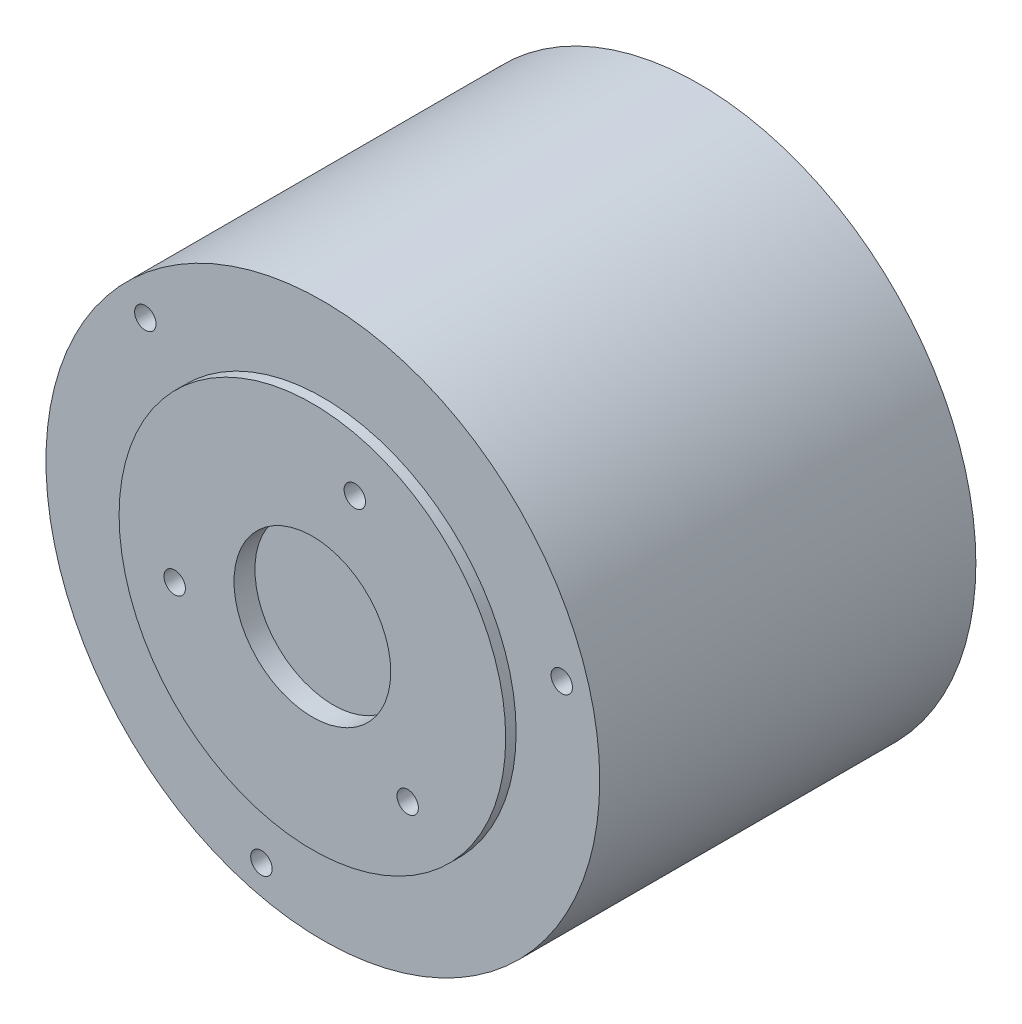
ISO-10303-21;
HEADER;
FILE_DESCRIPTION(('STEP AP214'),'2;1');
FILE_NAME('part.step','',(''),(''),'','','');
FILE_SCHEMA(('AUTOMOTIVE_DESIGN { 1 0 10303 214 1 1 1 1 }'));
ENDSEC;
DATA;
#1=APPLICATION_CONTEXT('core data for automotive mechanical design processes');
#2=APPLICATION_PROTOCOL_DEFINITION('international standard','automotive_design',2000,#1);
#3=PRODUCT_CONTEXT('',#1,'mechanical');
#4=PRODUCT('Part','Part','',(#3));
#5=PRODUCT_RELATED_PRODUCT_CATEGORY('part','',(#4));
#6=PRODUCT_DEFINITION_FORMATION('','',#4);
#7=PRODUCT_DEFINITION_CONTEXT('part definition',#1,'design');
#8=PRODUCT_DEFINITION('design','',#6,#7);
#9=PRODUCT_DEFINITION_SHAPE('','',#8);
#10=(LENGTH_UNIT() NAMED_UNIT(*) SI_UNIT(.MILLI.,.METRE.));
#11=(NAMED_UNIT(*) PLANE_ANGLE_UNIT() SI_UNIT($,.RADIAN.));
#12=(NAMED_UNIT(*) SI_UNIT($,.STERADIAN.) SOLID_ANGLE_UNIT());
#13=UNCERTAINTY_MEASURE_WITH_UNIT(LENGTH_MEASURE(1.E-05),#10,'distance_accuracy_value','');
#14=(GEOMETRIC_REPRESENTATION_CONTEXT(3) GLOBAL_UNCERTAINTY_ASSIGNED_CONTEXT((#13)) GLOBAL_UNIT_ASSIGNED_CONTEXT((#10,
#11,#12)) REPRESENTATION_CONTEXT('',''));
#15=CARTESIAN_POINT('',(0.,0.,0.));
#16=DIRECTION('',(0.,0.,1.));
#17=DIRECTION('',(1.,0.,0.));
#18=AXIS2_PLACEMENT_3D('',#15,#16,#17);
#19=CARTESIAN_POINT('',(0.,0.,-37.));
#20=DIRECTION('',(0.,0.,1.));
#21=DIRECTION('',(1.,0.,0.));
#22=AXIS2_PLACEMENT_3D('',#19,#20,#21);
#23=PLANE('',#22);
#24=CARTESIAN_POINT('',(-19.4855715851498,11.2499999999999,-37.0000000000001));
#25=DIRECTION('',(0.,0.,-1.));
#26=DIRECTION('',(0.,1.,0.));
#27=AXIS2_PLACEMENT_3D('',#24,#25,#26);
#28=CIRCLE('',#27,1.02499999999999);
#29=CARTESIAN_POINT('',(-19.4855715851498,12.2749999999999,-37.0000000000001));
#30=VERTEX_POINT('',#29);
#31=EDGE_CURVE('E119',#30,#30,#28,.T.);
#32=ORIENTED_EDGE('',*,*,#31,.F.);
#33=EDGE_LOOP('',(#32));
#34=FACE_BOUND('',#33,.T.);
#35=CARTESIAN_POINT('',(19.4855715851504,-11.2500000000002,-36.9999999999996));
#36=DIRECTION('',(0.,0.,-1.));
#37=DIRECTION('',(0.,1.,0.));
#38=AXIS2_PLACEMENT_3D('',#35,#36,#37);
#39=CIRCLE('',#38,1.02499999999999);
#40=CARTESIAN_POINT('',(19.4855715851504,-10.2250000000003,-36.9999999999996));
#41=VERTEX_POINT('',#40);
#42=EDGE_CURVE('E132',#41,#41,#39,.T.);
#43=ORIENTED_EDGE('',*,*,#42,.F.);
#44=EDGE_LOOP('',(#43));
#45=FACE_BOUND('',#44,.T.);
#46=CARTESIAN_POINT('',(19.4855715851502,11.25,-36.9999999999998));
#47=DIRECTION('',(0.,0.,-1.));
#48=DIRECTION('',(0.,1.,0.));
#49=AXIS2_PLACEMENT_3D('',#46,#47,#48);
#50=CIRCLE('',#49,1.02499999999999);
#51=CARTESIAN_POINT('',(19.4855715851502,12.275,-36.9999999999998));
#52=VERTEX_POINT('',#51);
#53=EDGE_CURVE('E140',#52,#52,#50,.T.);
#54=ORIENTED_EDGE('',*,*,#53,.F.);
#55=EDGE_LOOP('',(#54));
#56=FACE_BOUND('',#55,.T.);
#57=CARTESIAN_POINT('',(0.,22.5,-37.));
#58=DIRECTION('',(0.,0.,-1.));
#59=DIRECTION('',(-1.,0.,0.));
#60=AXIS2_PLACEMENT_3D('',#57,#58,#59);
#61=CIRCLE('',#60,1.02499999999999);
#62=CARTESIAN_POINT('',(-1.02499999999999,22.5,-37.));
#63=VERTEX_POINT('',#62);
#64=EDGE_CURVE('E180',#63,#63,#61,.T.);
#65=ORIENTED_EDGE('',*,*,#64,.F.);
#66=EDGE_LOOP('',(#65));
#67=FACE_BOUND('',#66,.T.);
#68=CARTESIAN_POINT('',(0.,0.,-37.));
#69=DIRECTION('',(0.,0.,1.));
#70=DIRECTION('',(1.,0.,0.));
#71=AXIS2_PLACEMENT_3D('',#68,#69,#70);
#72=CIRCLE('',#71,26.5);
#73=CARTESIAN_POINT('',(13.1624465810882,-23.,-37.));
#74=VERTEX_POINT('',#73);
#75=CARTESIAN_POINT('',(-13.1624465810882,-23.,-37.));
#76=VERTEX_POINT('',#75);
#77=EDGE_CURVE('E229',#74,#76,#72,.T.);
#78=ORIENTED_EDGE('',*,*,#77,.F.);
#79=DIRECTION('',(-1.,0.,0.));
#80=VECTOR('',#79,1.);
#81=CARTESIAN_POINT('',(0.,-23.,-37.));
#82=LINE('',#81,#80);
#83=EDGE_CURVE('E58',#74,#76,#82,.T.);
#84=ORIENTED_EDGE('',*,*,#83,.T.);
#85=EDGE_LOOP('',(#78,#84));
#86=FACE_BOUND('',#85,.T.);
#87=CARTESIAN_POINT('',(-19.4855715851498,-11.2500000000004,-36.9999999999999));
#88=DIRECTION('',(0.,0.,-1.));
#89=DIRECTION('',(0.,1.,0.));
#90=AXIS2_PLACEMENT_3D('',#87,#88,#89);
#91=CIRCLE('',#90,1.02499999999999);
#92=CARTESIAN_POINT('',(-19.4855715851498,-10.2250000000004,-36.9999999999999));
#93=VERTEX_POINT('',#92);
#94=EDGE_CURVE('E118',#93,#93,#91,.T.);
#95=ORIENTED_EDGE('',*,*,#94,.F.);
#96=EDGE_LOOP('',(#95));
#97=FACE_BOUND('',#96,.T.);
#98=ADVANCED_FACE('F49',(#34,#45,#56,#67,#86,#97),#23,.F.);
#99=CARTESIAN_POINT('',(0.,0.,-37.));
#100=DIRECTION('',(0.,0.,1.));
#101=DIRECTION('',(1.,0.,0.));
#102=AXIS2_PLACEMENT_3D('',#99,#100,#101);
#103=CYLINDRICAL_SURFACE('',#102,26.5);
#104=DIRECTION('',(0.,0.,1.));
#105=VECTOR('',#104,1.);
#106=CARTESIAN_POINT('',(-13.1624465810882,-23.,-37.));
#107=LINE('',#106,#105);
#108=CARTESIAN_POINT('',(-13.1624465810882,-23.,-24.5));
#109=VERTEX_POINT('',#108);
#110=EDGE_CURVE('E65',#109,#76,#107,.F.);
#111=ORIENTED_EDGE('',*,*,#110,.F.);
#112=CARTESIAN_POINT('',(0.,0.,-24.5));
#113=DIRECTION('',(0.,0.,1.));
#114=DIRECTION('',(1.,0.,0.));
#115=AXIS2_PLACEMENT_3D('',#112,#113,#114);
#116=CIRCLE('',#115,26.5);
#117=CARTESIAN_POINT('',(13.1624465810882,-23.,-24.5));
#118=VERTEX_POINT('',#117);
#119=EDGE_CURVE('E12',#118,#109,#116,.F.);
#120=ORIENTED_EDGE('',*,*,#119,.F.);
#121=DIRECTION('',(0.,0.,1.));
#122=VECTOR('',#121,1.);
#123=CARTESIAN_POINT('',(13.1624465810882,-23.,-37.));
#124=LINE('',#123,#122);
#125=EDGE_CURVE('E207',#74,#118,#124,.T.);
#126=ORIENTED_EDGE('',*,*,#125,.F.);
#127=ORIENTED_EDGE('',*,*,#77,.T.);
#128=EDGE_LOOP('',(#111,#120,#126,#127));
#129=FACE_BOUND('',#128,.T.);
#130=CARTESIAN_POINT('',(0.,0.,-1.));
#131=DIRECTION('',(0.,0.,1.));
#132=DIRECTION('',(1.,0.,0.));
#133=AXIS2_PLACEMENT_3D('',#130,#131,#132);
#134=CIRCLE('',#133,26.5);
#135=CARTESIAN_POINT('',(26.5,0.,-1.));
#136=VERTEX_POINT('',#135);
#137=EDGE_CURVE('E225',#136,#136,#134,.F.);
#138=ORIENTED_EDGE('',*,*,#137,.T.);
#139=EDGE_LOOP('',(#138));
#140=FACE_BOUND('',#139,.T.);
#141=ADVANCED_FACE('F51',(#129,#140),#103,.T.);
#142=CARTESIAN_POINT('',(0.,0.,-1.));
#143=DIRECTION('',(0.,0.,1.));
#144=DIRECTION('',(1.,0.,0.));
#145=AXIS2_PLACEMENT_3D('',#142,#143,#144);
#146=PLANE('',#145);
#147=CARTESIAN_POINT('',(22.8672908873142,6.41478818628922,-1.));
#148=DIRECTION('',(0.,0.,1.));
#149=DIRECTION('',(0.,-1.,0.));
#150=AXIS2_PLACEMENT_3D('',#147,#148,#149);
#151=CIRCLE('',#150,1.02499999999999);
#152=CARTESIAN_POINT('',(22.8672908873142,5.38978818628923,-0.999999999999987));
#153=VERTEX_POINT('',#152);
#154=EDGE_CURVE('E164',#153,#153,#151,.T.);
#155=ORIENTED_EDGE('',*,*,#154,.F.);
#156=EDGE_LOOP('',(#155));
#157=FACE_BOUND('',#156,.T.);
#158=CARTESIAN_POINT('',(-16.98901497288,16.5962607309978,-1.00000000000034));
#159=DIRECTION('',(0.,0.,1.));
#160=DIRECTION('',(0.,-1.,0.));
#161=AXIS2_PLACEMENT_3D('',#158,#159,#160);
#162=CIRCLE('',#161,1.02499999999999);
#163=CARTESIAN_POINT('',(-16.98901497288,15.5712607309978,-1.00000000000034));
#164=VERTEX_POINT('',#163);
#165=EDGE_CURVE('E172',#164,#164,#162,.T.);
#166=ORIENTED_EDGE('',*,*,#165,.F.);
#167=EDGE_LOOP('',(#166));
#168=FACE_BOUND('',#167,.T.);
#169=CARTESIAN_POINT('',(-5.87827591443412,-23.0110489172872,-0.999999999999999));
#170=DIRECTION('',(0.,0.,1.));
#171=DIRECTION('',(1.,0.,0.));
#172=AXIS2_PLACEMENT_3D('',#169,#170,#171);
#173=CIRCLE('',#172,1.02499999999999);
#174=CARTESIAN_POINT('',(-4.85327591443413,-23.0110489172872,-0.999999999999999));
#175=VERTEX_POINT('',#174);
#176=EDGE_CURVE('E196',#175,#175,#173,.T.);
#177=ORIENTED_EDGE('',*,*,#176,.F.);
#178=EDGE_LOOP('',(#177));
#179=FACE_BOUND('',#178,.T.);
#180=ORIENTED_EDGE('',*,*,#137,.F.);
#181=EDGE_LOOP('',(#180));
#182=FACE_BOUND('',#181,.T.);
#183=CARTESIAN_POINT('',(0.,0.,-1.));
#184=DIRECTION('',(0.,0.,1.));
#185=DIRECTION('',(1.,0.,0.));
#186=AXIS2_PLACEMENT_3D('',#183,#184,#185);
#187=CIRCLE('',#186,18.5);
#188=CARTESIAN_POINT('',(18.5,0.,-1.));
#189=VERTEX_POINT('',#188);
#190=EDGE_CURVE('E221',#189,#189,#187,.T.);
#191=ORIENTED_EDGE('',*,*,#190,.F.);
#192=EDGE_LOOP('',(#191));
#193=FACE_BOUND('',#192,.T.);
#194=ADVANCED_FACE('F264',(#157,#168,#179,#182,#193),#146,.T.);
#195=CARTESIAN_POINT('',(0.,0.,-1.));
#196=DIRECTION('',(0.,0.,1.));
#197=DIRECTION('',(1.,0.,0.));
#198=AXIS2_PLACEMENT_3D('',#195,#196,#197);
#199=CYLINDRICAL_SURFACE('',#198,18.5);
#200=ORIENTED_EDGE('',*,*,#190,.T.);
#201=EDGE_LOOP('',(#200));
#202=FACE_BOUND('',#201,.T.);
#203=CARTESIAN_POINT('',(0.,0.,0.));
#204=DIRECTION('',(0.,0.,1.));
#205=DIRECTION('',(1.,0.,0.));
#206=AXIS2_PLACEMENT_3D('',#203,#204,#205);
#207=CIRCLE('',#206,18.5);
#208=CARTESIAN_POINT('',(18.5,0.,0.));
#209=VERTEX_POINT('',#208);
#210=EDGE_CURVE('E217',#209,#209,#207,.T.);
#211=ORIENTED_EDGE('',*,*,#210,.F.);
#212=EDGE_LOOP('',(#211));
#213=FACE_BOUND('',#212,.T.);
#214=ADVANCED_FACE('F272',(#202,#213),#199,.T.);
#215=CARTESIAN_POINT('',(0.,0.,0.));
#216=DIRECTION('',(0.,0.,1.));
#217=DIRECTION('',(1.,0.,0.));
#218=AXIS2_PLACEMENT_3D('',#215,#216,#217);
#219=PLANE('',#218);
#220=CARTESIAN_POINT('',(-13.1799960961191,-2.92193478816436,0.));
#221=DIRECTION('',(0.,0.,1.));
#222=DIRECTION('',(0.,-1.,0.));
#223=AXIS2_PLACEMENT_3D('',#220,#221,#222);
#224=CIRCLE('',#223,1.02499999999999);
#225=CARTESIAN_POINT('',(-13.1799960961191,-3.94693478816435,0.));
#226=VERTEX_POINT('',#225);
#227=EDGE_CURVE('E148',#226,#226,#224,.T.);
#228=ORIENTED_EDGE('',*,*,#227,.F.);
#229=EDGE_LOOP('',(#228));
#230=FACE_BOUND('',#229,.T.);
#231=CARTESIAN_POINT('',(9.12046780281143,-9.95324404693666,1.89987469368766E-13));
#232=DIRECTION('',(0.,0.,1.));
#233=DIRECTION('',(0.,-1.,0.));
#234=AXIS2_PLACEMENT_3D('',#231,#232,#233);
#235=CIRCLE('',#234,1.02499999999999);
#236=CARTESIAN_POINT('',(9.12046780281143,-10.9782440469366,1.94380875931622E-13));
#237=VERTEX_POINT('',#236);
#238=EDGE_CURVE('E156',#237,#237,#235,.T.);
#239=ORIENTED_EDGE('',*,*,#238,.F.);
#240=EDGE_LOOP('',(#239));
#241=FACE_BOUND('',#240,.T.);
#242=CARTESIAN_POINT('',(4.0595282933076,12.8751788351011,0.));
#243=DIRECTION('',(0.,0.,1.));
#244=DIRECTION('',(1.,0.,0.));
#245=AXIS2_PLACEMENT_3D('',#242,#243,#244);
#246=CIRCLE('',#245,1.02499999999999);
#247=CARTESIAN_POINT('',(5.08452829330759,12.8751788351011,0.));
#248=VERTEX_POINT('',#247);
#249=EDGE_CURVE('E188',#248,#248,#246,.T.);
#250=ORIENTED_EDGE('',*,*,#249,.F.);
#251=EDGE_LOOP('',(#250));
#252=FACE_BOUND('',#251,.T.);
#253=CARTESIAN_POINT('',(0.,0.,0.));
#254=DIRECTION('',(0.,0.,1.));
#255=DIRECTION('',(1.,0.,0.));
#256=AXIS2_PLACEMENT_3D('',#253,#254,#255);
#257=CIRCLE('',#256,7.50000000000001);
#258=CARTESIAN_POINT('',(7.50000000000001,0.,0.));
#259=VERTEX_POINT('',#258);
#260=EDGE_CURVE('E212',#259,#259,#257,.T.);
#261=ORIENTED_EDGE('',*,*,#260,.F.);
#262=EDGE_LOOP('',(#261));
#263=FACE_BOUND('',#262,.T.);
#264=ORIENTED_EDGE('',*,*,#210,.T.);
#265=EDGE_LOOP('',(#264));
#266=FACE_BOUND('',#265,.T.);
#267=ADVANCED_FACE('F269',(#230,#241,#252,#263,#266),#219,.T.);
#268=CARTESIAN_POINT('',(0.,0.,-2.));
#269=DIRECTION('',(0.,0.,1.));
#270=DIRECTION('',(1.,0.,0.));
#271=AXIS2_PLACEMENT_3D('',#268,#269,#270);
#272=CYLINDRICAL_SURFACE('',#271,7.50000000000001);
#273=CARTESIAN_POINT('',(0.,0.,-2.));
#274=DIRECTION('',(0.,0.,1.));
#275=DIRECTION('',(1.,0.,0.));
#276=AXIS2_PLACEMENT_3D('',#273,#274,#275);
#277=CIRCLE('',#276,7.50000000000001);
#278=CARTESIAN_POINT('',(7.50000000000001,0.,-2.));
#279=VERTEX_POINT('',#278);
#280=EDGE_CURVE('E213',#279,#279,#277,.T.);
#281=ORIENTED_EDGE('',*,*,#280,.F.);
#282=EDGE_LOOP('',(#281));
#283=FACE_BOUND('',#282,.T.);
#284=ORIENTED_EDGE('',*,*,#260,.T.);
#285=EDGE_LOOP('',(#284));
#286=FACE_BOUND('',#285,.T.);
#287=ADVANCED_FACE('F271',(#283,#286),#272,.F.);
#288=CARTESIAN_POINT('',(0.,0.,-2.));
#289=DIRECTION('',(0.,0.,1.));
#290=DIRECTION('',(1.,0.,0.));
#291=AXIS2_PLACEMENT_3D('',#288,#289,#290);
#292=PLANE('',#291);
#293=ORIENTED_EDGE('',*,*,#280,.T.);
#294=EDGE_LOOP('',(#293));
#295=FACE_BOUND('',#294,.T.);
#296=ADVANCED_FACE('F256',(#295),#292,.T.);
#297=CARTESIAN_POINT('',(-15.,-23.,-37.));
#298=DIRECTION('',(0.,1.,0.));
#299=DIRECTION('',(0.,0.,1.));
#300=AXIS2_PLACEMENT_3D('',#297,#298,#299);
#301=PLANE('',#300);
#302=ORIENTED_EDGE('',*,*,#110,.T.);
#303=ORIENTED_EDGE('',*,*,#83,.F.);
#304=ORIENTED_EDGE('',*,*,#125,.T.);
#305=DIRECTION('',(-1.,0.,0.));
#306=VECTOR('',#305,1.);
#307=CARTESIAN_POINT('',(-15.,-23.,-24.5));
#308=LINE('',#307,#306);
#309=EDGE_CURVE('E204',#118,#109,#308,.T.);
#310=ORIENTED_EDGE('',*,*,#309,.T.);
#311=EDGE_LOOP('',(#302,#303,#304,#310));
#312=FACE_BOUND('',#311,.T.);
#313=ADVANCED_FACE('F243',(#312),#301,.F.);
#314=CARTESIAN_POINT('',(0.,0.,-24.5));
#315=DIRECTION('',(0.,0.,1.));
#316=DIRECTION('',(1.,0.,0.));
#317=AXIS2_PLACEMENT_3D('',#314,#315,#316);
#318=PLANE('',#317);
#319=ORIENTED_EDGE('',*,*,#119,.T.);
#320=ORIENTED_EDGE('',*,*,#309,.F.);
#321=EDGE_LOOP('',(#319,#320));
#322=FACE_BOUND('',#321,.T.);
#323=ADVANCED_FACE('F245',(#322),#318,.F.);
#324=CARTESIAN_POINT('',(-5.87827591443412,-23.0110489172872,-7.35));
#325=DIRECTION('',(0.,0.,1.));
#326=DIRECTION('',(1.,0.,0.));
#327=AXIS2_PLACEMENT_3D('',#324,#325,#326);
#328=CONICAL_SURFACE('',#327,1.025,1.02974425867665);
#329=CARTESIAN_POINT('',(-5.87827591443412,-23.0110489172872,-7.96588213450325));
#330=VERTEX_POINT('',#329);
#331=VERTEX_LOOP('',#330);
#332=FACE_BOUND('',#331,.T.);
#333=CARTESIAN_POINT('',(-5.87827591443412,-23.0110489172872,-7.35));
#334=DIRECTION('',(0.,0.,1.));
#335=DIRECTION('',(1.,0.,0.));
#336=AXIS2_PLACEMENT_3D('',#333,#334,#335);
#337=CIRCLE('',#336,1.025);
#338=CARTESIAN_POINT('',(-4.85327591443412,-23.0110489172872,-7.35));
#339=VERTEX_POINT('',#338);
#340=EDGE_CURVE('E200',#339,#339,#337,.T.);
#341=ORIENTED_EDGE('',*,*,#340,.T.);
#342=EDGE_LOOP('',(#341));
#343=FACE_BOUND('',#342,.T.);
#344=ADVANCED_FACE('F247',(#332,#343),#328,.F.);
#345=CARTESIAN_POINT('',(-5.87827591443412,-23.0110489172872,-1.));
#346=DIRECTION('',(0.,0.,1.));
#347=DIRECTION('',(1.,0.,0.));
#348=AXIS2_PLACEMENT_3D('',#345,#346,#347);
#349=CYLINDRICAL_SURFACE('',#348,1.02499999999999);
#350=ORIENTED_EDGE('',*,*,#340,.F.);
#351=EDGE_LOOP('',(#350));
#352=FACE_BOUND('',#351,.T.);
#353=ORIENTED_EDGE('',*,*,#176,.T.);
#354=EDGE_LOOP('',(#353));
#355=FACE_BOUND('',#354,.T.);
#356=ADVANCED_FACE('F253',(#352,#355),#349,.F.);
#357=CARTESIAN_POINT('',(4.0595282933076,12.8751788351011,-4.35));
#358=DIRECTION('',(0.,0.,1.));
#359=DIRECTION('',(1.,0.,0.));
#360=AXIS2_PLACEMENT_3D('',#357,#358,#359);
#361=CONICAL_SURFACE('',#360,1.025,1.02974425867665);
#362=CARTESIAN_POINT('',(4.0595282933076,12.8751788351011,-4.96588213450325));
#363=VERTEX_POINT('',#362);
#364=VERTEX_LOOP('',#363);
#365=FACE_BOUND('',#364,.T.);
#366=CARTESIAN_POINT('',(4.0595282933076,12.8751788351011,-4.35));
#367=DIRECTION('',(0.,0.,1.));
#368=DIRECTION('',(1.,0.,0.));
#369=AXIS2_PLACEMENT_3D('',#366,#367,#368);
#370=CIRCLE('',#369,1.025);
#371=CARTESIAN_POINT('',(5.0845282933076,12.8751788351011,-4.35));
#372=VERTEX_POINT('',#371);
#373=EDGE_CURVE('E192',#372,#372,#370,.T.);
#374=ORIENTED_EDGE('',*,*,#373,.T.);
#375=EDGE_LOOP('',(#374));
#376=FACE_BOUND('',#375,.T.);
#377=ADVANCED_FACE('F296',(#365,#376),#361,.F.);
#378=CARTESIAN_POINT('',(4.0595282933076,12.8751788351011,0.));
#379=DIRECTION('',(0.,0.,1.));
#380=DIRECTION('',(1.,0.,0.));
#381=AXIS2_PLACEMENT_3D('',#378,#379,#380);
#382=CYLINDRICAL_SURFACE('',#381,1.02499999999999);
#383=ORIENTED_EDGE('',*,*,#373,.F.);
#384=EDGE_LOOP('',(#383));
#385=FACE_BOUND('',#384,.T.);
#386=ORIENTED_EDGE('',*,*,#249,.T.);
#387=EDGE_LOOP('',(#386));
#388=FACE_BOUND('',#387,.T.);
#389=ADVANCED_FACE('F293',(#385,#388),#382,.F.);
#390=CARTESIAN_POINT('',(0.,22.5,-30.65));
#391=DIRECTION('',(0.,0.,-1.));
#392=DIRECTION('',(-1.,0.,0.));
#393=AXIS2_PLACEMENT_3D('',#390,#391,#392);
#394=CONICAL_SURFACE('',#393,1.025,1.02974425867665);
#395=CARTESIAN_POINT('',(0.,22.5,-30.0341178654967));
#396=VERTEX_POINT('',#395);
#397=VERTEX_LOOP('',#396);
#398=FACE_BOUND('',#397,.T.);
#399=CARTESIAN_POINT('',(0.,22.5,-30.65));
#400=DIRECTION('',(0.,0.,-1.));
#401=DIRECTION('',(-1.,0.,0.));
#402=AXIS2_PLACEMENT_3D('',#399,#400,#401);
#403=CIRCLE('',#402,1.025);
#404=CARTESIAN_POINT('',(-1.025,22.5,-30.65));
#405=VERTEX_POINT('',#404);
#406=EDGE_CURVE('E184',#405,#405,#403,.T.);
#407=ORIENTED_EDGE('',*,*,#406,.T.);
#408=EDGE_LOOP('',(#407));
#409=FACE_BOUND('',#408,.T.);
#410=ADVANCED_FACE('F295',(#398,#409),#394,.F.);
#411=CARTESIAN_POINT('',(0.,22.5,-37.));
#412=DIRECTION('',(0.,0.,-1.));
#413=DIRECTION('',(-1.,0.,0.));
#414=AXIS2_PLACEMENT_3D('',#411,#412,#413);
#415=CYLINDRICAL_SURFACE('',#414,1.02499999999999);
#416=ORIENTED_EDGE('',*,*,#406,.F.);
#417=EDGE_LOOP('',(#416));
#418=FACE_BOUND('',#417,.T.);
#419=ORIENTED_EDGE('',*,*,#64,.T.);
#420=EDGE_LOOP('',(#419));
#421=FACE_BOUND('',#420,.T.);
#422=ADVANCED_FACE('F303',(#418,#421),#415,.F.);
#423=CARTESIAN_POINT('',(-16.98901497288,16.5962607309978,-7.35000000000034));
#424=DIRECTION('',(0.,0.,1.));
#425=DIRECTION('',(0.,-1.,0.));
#426=AXIS2_PLACEMENT_3D('',#423,#424,#425);
#427=CONICAL_SURFACE('',#426,1.025,1.02974425867665);
#428=CARTESIAN_POINT('',(-16.98901497288,16.5962607309978,-7.96588213450359));
#429=VERTEX_POINT('',#428);
#430=VERTEX_LOOP('',#429);
#431=FACE_BOUND('',#430,.T.);
#432=CARTESIAN_POINT('',(-16.98901497288,16.5962607309978,-7.35000000000034));
#433=DIRECTION('',(0.,0.,1.));
#434=DIRECTION('',(0.,-1.,0.));
#435=AXIS2_PLACEMENT_3D('',#432,#433,#434);
#436=CIRCLE('',#435,1.025);
#437=CARTESIAN_POINT('',(-16.98901497288,15.5712607309978,-7.35000000000034));
#438=VERTEX_POINT('',#437);
#439=EDGE_CURVE('E176',#438,#438,#436,.T.);
#440=ORIENTED_EDGE('',*,*,#439,.T.);
#441=EDGE_LOOP('',(#440));
#442=FACE_BOUND('',#441,.T.);
#443=ADVANCED_FACE('F334',(#431,#442),#427,.F.);
#444=CARTESIAN_POINT('',(-16.98901497288,16.5962607309978,-1.00000000000034));
#445=DIRECTION('',(0.,0.,1.));
#446=DIRECTION('',(0.,-1.,0.));
#447=AXIS2_PLACEMENT_3D('',#444,#445,#446);
#448=CYLINDRICAL_SURFACE('',#447,1.02499999999999);
#449=ORIENTED_EDGE('',*,*,#439,.F.);
#450=EDGE_LOOP('',(#449));
#451=FACE_BOUND('',#450,.T.);
#452=ORIENTED_EDGE('',*,*,#165,.T.);
#453=EDGE_LOOP('',(#452));
#454=FACE_BOUND('',#453,.T.);
#455=ADVANCED_FACE('F331',(#451,#454),#448,.F.);
#456=CARTESIAN_POINT('',(22.8672908873142,6.41478818628911,-7.35));
#457=DIRECTION('',(0.,0.,1.));
#458=DIRECTION('',(0.,-1.,0.));
#459=AXIS2_PLACEMENT_3D('',#456,#457,#458);
#460=CONICAL_SURFACE('',#459,1.025,1.02974425867665);
#461=CARTESIAN_POINT('',(22.8672908873142,6.4147881862891,-7.96588213450325));
#462=VERTEX_POINT('',#461);
#463=VERTEX_LOOP('',#462);
#464=FACE_BOUND('',#463,.T.);
#465=CARTESIAN_POINT('',(22.8672908873142,6.41478818628911,-7.35));
#466=DIRECTION('',(0.,0.,1.));
#467=DIRECTION('',(0.,-1.,0.));
#468=AXIS2_PLACEMENT_3D('',#465,#466,#467);
#469=CIRCLE('',#468,1.025);
#470=CARTESIAN_POINT('',(22.8672908873142,5.38978818628912,-7.34999999999999));
#471=VERTEX_POINT('',#470);
#472=EDGE_CURVE('E168',#471,#471,#469,.T.);
#473=ORIENTED_EDGE('',*,*,#472,.T.);
#474=EDGE_LOOP('',(#473));
#475=FACE_BOUND('',#474,.T.);
#476=ADVANCED_FACE('F333',(#464,#475),#460,.F.);
#477=CARTESIAN_POINT('',(22.8672908873142,6.41478818628922,-1.));
#478=DIRECTION('',(0.,0.,1.));
#479=DIRECTION('',(0.,-1.,0.));
#480=AXIS2_PLACEMENT_3D('',#477,#478,#479);
#481=CYLINDRICAL_SURFACE('',#480,1.02499999999999);
#482=ORIENTED_EDGE('',*,*,#472,.F.);
#483=EDGE_LOOP('',(#482));
#484=FACE_BOUND('',#483,.T.);
#485=ORIENTED_EDGE('',*,*,#154,.T.);
#486=EDGE_LOOP('',(#485));
#487=FACE_BOUND('',#486,.T.);
#488=ADVANCED_FACE('F341',(#484,#487),#481,.F.);
#489=CARTESIAN_POINT('',(9.12046780281143,-9.95324404693667,-4.34999999999981));
#490=DIRECTION('',(0.,0.,1.));
#491=DIRECTION('',(0.,-1.,0.));
#492=AXIS2_PLACEMENT_3D('',#489,#490,#491);
#493=CONICAL_SURFACE('',#492,1.025,1.02974425867665);
#494=CARTESIAN_POINT('',(9.12046780281143,-9.95324404693668,-4.96588213450306));
#495=VERTEX_POINT('',#494);
#496=VERTEX_LOOP('',#495);
#497=FACE_BOUND('',#496,.T.);
#498=CARTESIAN_POINT('',(9.12046780281143,-9.95324404693667,-4.34999999999981));
#499=DIRECTION('',(0.,0.,1.));
#500=DIRECTION('',(0.,-1.,0.));
#501=AXIS2_PLACEMENT_3D('',#498,#499,#500);
#502=CIRCLE('',#501,1.025);
#503=CARTESIAN_POINT('',(9.12046780281143,-10.9782440469367,-4.34999999999981));
#504=VERTEX_POINT('',#503);
#505=EDGE_CURVE('E160',#504,#504,#502,.T.);
#506=ORIENTED_EDGE('',*,*,#505,.T.);
#507=EDGE_LOOP('',(#506));
#508=FACE_BOUND('',#507,.T.);
#509=ADVANCED_FACE('F396',(#497,#508),#493,.F.);
#510=CARTESIAN_POINT('',(9.12046780281143,-9.95324404693666,1.88557694230762E-13));
#511=DIRECTION('',(0.,0.,1.));
#512=DIRECTION('',(0.,-1.,0.));
#513=AXIS2_PLACEMENT_3D('',#510,#511,#512);
#514=CYLINDRICAL_SURFACE('',#513,1.02499999999999);
#515=ORIENTED_EDGE('',*,*,#505,.F.);
#516=EDGE_LOOP('',(#515));
#517=FACE_BOUND('',#516,.T.);
#518=ORIENTED_EDGE('',*,*,#238,.T.);
#519=EDGE_LOOP('',(#518));
#520=FACE_BOUND('',#519,.T.);
#521=ADVANCED_FACE('F418',(#517,#520),#514,.F.);
#522=CARTESIAN_POINT('',(-13.1799960961191,-2.92193478816443,-4.35000000000001));
#523=DIRECTION('',(0.,0.,1.));
#524=DIRECTION('',(0.,-1.,0.));
#525=AXIS2_PLACEMENT_3D('',#522,#523,#524);
#526=CONICAL_SURFACE('',#525,1.025,1.02974425867665);
#527=CARTESIAN_POINT('',(-13.1799960961191,-2.92193478816443,-4.96588213450326));
#528=VERTEX_POINT('',#527);
#529=VERTEX_LOOP('',#528);
#530=FACE_BOUND('',#529,.T.);
#531=CARTESIAN_POINT('',(-13.1799960961191,-2.92193478816443,-4.35000000000001));
#532=DIRECTION('',(0.,0.,1.));
#533=DIRECTION('',(0.,-1.,0.));
#534=AXIS2_PLACEMENT_3D('',#531,#532,#533);
#535=CIRCLE('',#534,1.025);
#536=CARTESIAN_POINT('',(-13.1799960961191,-3.94693478816442,-4.34999999999999));
#537=VERTEX_POINT('',#536);
#538=EDGE_CURVE('E152',#537,#537,#535,.T.);
#539=ORIENTED_EDGE('',*,*,#538,.T.);
#540=EDGE_LOOP('',(#539));
#541=FACE_BOUND('',#540,.T.);
#542=ADVANCED_FACE('F429',(#530,#541),#526,.F.);
#543=CARTESIAN_POINT('',(-13.1799960961191,-2.92193478816436,0.));
#544=DIRECTION('',(0.,0.,1.));
#545=DIRECTION('',(0.,-1.,0.));
#546=AXIS2_PLACEMENT_3D('',#543,#544,#545);
#547=CYLINDRICAL_SURFACE('',#546,1.02499999999999);
#548=ORIENTED_EDGE('',*,*,#538,.F.);
#549=EDGE_LOOP('',(#548));
#550=FACE_BOUND('',#549,.T.);
#551=ORIENTED_EDGE('',*,*,#227,.T.);
#552=EDGE_LOOP('',(#551));
#553=FACE_BOUND('',#552,.T.);
#554=ADVANCED_FACE('F441',(#550,#553),#547,.F.);
#555=CARTESIAN_POINT('',(19.4855715851502,11.25,-30.6499999999998));
#556=DIRECTION('',(0.,0.,-1.));
#557=DIRECTION('',(0.,1.,0.));
#558=AXIS2_PLACEMENT_3D('',#555,#556,#557);
#559=CONICAL_SURFACE('',#558,1.025,1.02974425867666);
#560=CARTESIAN_POINT('',(19.4855715851502,11.25,-30.0341178654965));
#561=VERTEX_POINT('',#560);
#562=VERTEX_LOOP('',#561);
#563=FACE_BOUND('',#562,.T.);
#564=CARTESIAN_POINT('',(19.4855715851502,11.25,-30.6499999999998));
#565=DIRECTION('',(0.,0.,-1.));
#566=DIRECTION('',(0.,1.,0.));
#567=AXIS2_PLACEMENT_3D('',#564,#565,#566);
#568=CIRCLE('',#567,1.025);
#569=CARTESIAN_POINT('',(19.4855715851502,12.275,-30.6499999999998));
#570=VERTEX_POINT('',#569);
#571=EDGE_CURVE('E144',#570,#570,#568,.T.);
#572=ORIENTED_EDGE('',*,*,#571,.T.);
#573=EDGE_LOOP('',(#572));
#574=FACE_BOUND('',#573,.T.);
#575=ADVANCED_FACE('F453',(#563,#574),#559,.F.);
#576=CARTESIAN_POINT('',(19.4855715851502,11.25,-36.9999999999998));
#577=DIRECTION('',(0.,0.,-1.));
#578=DIRECTION('',(0.,1.,0.));
#579=AXIS2_PLACEMENT_3D('',#576,#577,#578);
#580=CYLINDRICAL_SURFACE('',#579,1.02499999999999);
#581=ORIENTED_EDGE('',*,*,#571,.F.);
#582=EDGE_LOOP('',(#581));
#583=FACE_BOUND('',#582,.T.);
#584=ORIENTED_EDGE('',*,*,#53,.T.);
#585=EDGE_LOOP('',(#584));
#586=FACE_BOUND('',#585,.T.);
#587=ADVANCED_FACE('F477',(#583,#586),#580,.F.);
#588=CARTESIAN_POINT('',(19.4855715851504,-11.2500000000002,-30.6499999999996));
#589=DIRECTION('',(0.,0.,-1.));
#590=DIRECTION('',(0.,1.,0.));
#591=AXIS2_PLACEMENT_3D('',#588,#589,#590);
#592=CONICAL_SURFACE('',#591,1.025,1.02974425867666);
#593=CARTESIAN_POINT('',(19.4855715851504,-11.2500000000002,-30.0341178654964));
#594=VERTEX_POINT('',#593);
#595=VERTEX_LOOP('',#594);
#596=FACE_BOUND('',#595,.T.);
#597=CARTESIAN_POINT('',(19.4855715851504,-11.2500000000002,-30.6499999999996));
#598=DIRECTION('',(0.,0.,-1.));
#599=DIRECTION('',(0.,1.,0.));
#600=AXIS2_PLACEMENT_3D('',#597,#598,#599);
#601=CIRCLE('',#600,1.025);
#602=CARTESIAN_POINT('',(19.4855715851504,-10.2250000000002,-30.6499999999996));
#603=VERTEX_POINT('',#602);
#604=EDGE_CURVE('E136',#603,#603,#601,.T.);
#605=ORIENTED_EDGE('',*,*,#604,.T.);
#606=EDGE_LOOP('',(#605));
#607=FACE_BOUND('',#606,.T.);
#608=ADVANCED_FACE('F487',(#596,#607),#592,.F.);
#609=CARTESIAN_POINT('',(19.4855715851504,-11.2500000000002,-36.9999999999996));
#610=DIRECTION('',(0.,0.,-1.));
#611=DIRECTION('',(0.,1.,0.));
#612=AXIS2_PLACEMENT_3D('',#609,#610,#611);
#613=CYLINDRICAL_SURFACE('',#612,1.02499999999999);
#614=ORIENTED_EDGE('',*,*,#604,.F.);
#615=EDGE_LOOP('',(#614));
#616=FACE_BOUND('',#615,.T.);
#617=ORIENTED_EDGE('',*,*,#42,.T.);
#618=EDGE_LOOP('',(#617));
#619=FACE_BOUND('',#618,.T.);
#620=ADVANCED_FACE('F499',(#616,#619),#613,.F.);
#621=CARTESIAN_POINT('',(-19.4855715851498,-11.2500000000003,-30.6499999999999));
#622=DIRECTION('',(0.,0.,-1.));
#623=DIRECTION('',(0.,1.,0.));
#624=AXIS2_PLACEMENT_3D('',#621,#622,#623);
#625=CONICAL_SURFACE('',#624,1.025,1.02974425867666);
#626=CARTESIAN_POINT('',(-19.4855715851498,-11.2500000000003,-30.0341178654967));
#627=VERTEX_POINT('',#626);
#628=VERTEX_LOOP('',#627);
#629=FACE_BOUND('',#628,.T.);
#630=CARTESIAN_POINT('',(-19.4855715851498,-11.2500000000003,-30.6499999999999));
#631=DIRECTION('',(0.,0.,-1.));
#632=DIRECTION('',(0.,1.,0.));
#633=AXIS2_PLACEMENT_3D('',#630,#631,#632);
#634=CIRCLE('',#633,1.025);
#635=CARTESIAN_POINT('',(-19.4855715851498,-10.2250000000003,-30.6499999999999));
#636=VERTEX_POINT('',#635);
#637=EDGE_CURVE('E124',#636,#636,#634,.T.);
#638=ORIENTED_EDGE('',*,*,#637,.T.);
#639=EDGE_LOOP('',(#638));
#640=FACE_BOUND('',#639,.T.);
#641=ADVANCED_FACE('F511',(#629,#640),#625,.F.);
#642=CARTESIAN_POINT('',(-19.4855715851498,-11.2500000000004,-36.9999999999999));
#643=DIRECTION('',(0.,0.,-1.));
#644=DIRECTION('',(0.,1.,0.));
#645=AXIS2_PLACEMENT_3D('',#642,#643,#644);
#646=CYLINDRICAL_SURFACE('',#645,1.02499999999999);
#647=ORIENTED_EDGE('',*,*,#637,.F.);
#648=EDGE_LOOP('',(#647));
#649=FACE_BOUND('',#648,.T.);
#650=ORIENTED_EDGE('',*,*,#94,.T.);
#651=EDGE_LOOP('',(#650));
#652=FACE_BOUND('',#651,.T.);
#653=ADVANCED_FACE('F111',(#649,#652),#646,.F.);
#654=CARTESIAN_POINT('',(-19.4855715851498,11.2499999999999,-30.6500000000001));
#655=DIRECTION('',(0.,0.,-1.));
#656=DIRECTION('',(0.,1.,0.));
#657=AXIS2_PLACEMENT_3D('',#654,#655,#656);
#658=CONICAL_SURFACE('',#657,1.025,1.02974425867666);
#659=CARTESIAN_POINT('',(-19.4855715851498,11.2499999999999,-30.0341178654968));
#660=VERTEX_POINT('',#659);
#661=VERTEX_LOOP('',#660);
#662=FACE_BOUND('',#661,.T.);
#663=CARTESIAN_POINT('',(-19.4855715851498,11.2499999999999,-30.6500000000001));
#664=DIRECTION('',(0.,0.,-1.));
#665=DIRECTION('',(0.,1.,0.));
#666=AXIS2_PLACEMENT_3D('',#663,#664,#665);
#667=CIRCLE('',#666,1.025);
#668=CARTESIAN_POINT('',(-19.4855715851498,12.2749999999999,-30.6500000000001));
#669=VERTEX_POINT('',#668);
#670=EDGE_CURVE('E115',#669,#669,#667,.T.);
#671=ORIENTED_EDGE('',*,*,#670,.T.);
#672=EDGE_LOOP('',(#671));
#673=FACE_BOUND('',#672,.T.);
#674=ADVANCED_FACE('F107',(#662,#673),#658,.F.);
#675=CARTESIAN_POINT('',(-19.4855715851498,11.2499999999999,-37.0000000000001));
#676=DIRECTION('',(0.,0.,-1.));
#677=DIRECTION('',(0.,1.,0.));
#678=AXIS2_PLACEMENT_3D('',#675,#676,#677);
#679=CYLINDRICAL_SURFACE('',#678,1.02499999999999);
#680=ORIENTED_EDGE('',*,*,#670,.F.);
#681=EDGE_LOOP('',(#680));
#682=FACE_BOUND('',#681,.T.);
#683=ORIENTED_EDGE('',*,*,#31,.T.);
#684=EDGE_LOOP('',(#683));
#685=FACE_BOUND('',#684,.T.);
#686=ADVANCED_FACE('F110',(#682,#685),#679,.F.);
#687=CLOSED_SHELL('',(#98,#141,#194,#214,#267,#287,#296,#313,#323,#344,#356,#377,#389,#410,#422,
#443,#455,#476,#488,#509,#521,#542,#554,#575,#587,#608,#620,#641,#653,#674,#686));
#688=MANIFOLD_SOLID_BREP('B2',#687);
#689=ADVANCED_BREP_SHAPE_REPRESENTATION('',(#18,#688),#14);
#690=SHAPE_DEFINITION_REPRESENTATION(#9,#689);
ENDSEC;
END-ISO-10303-21;
